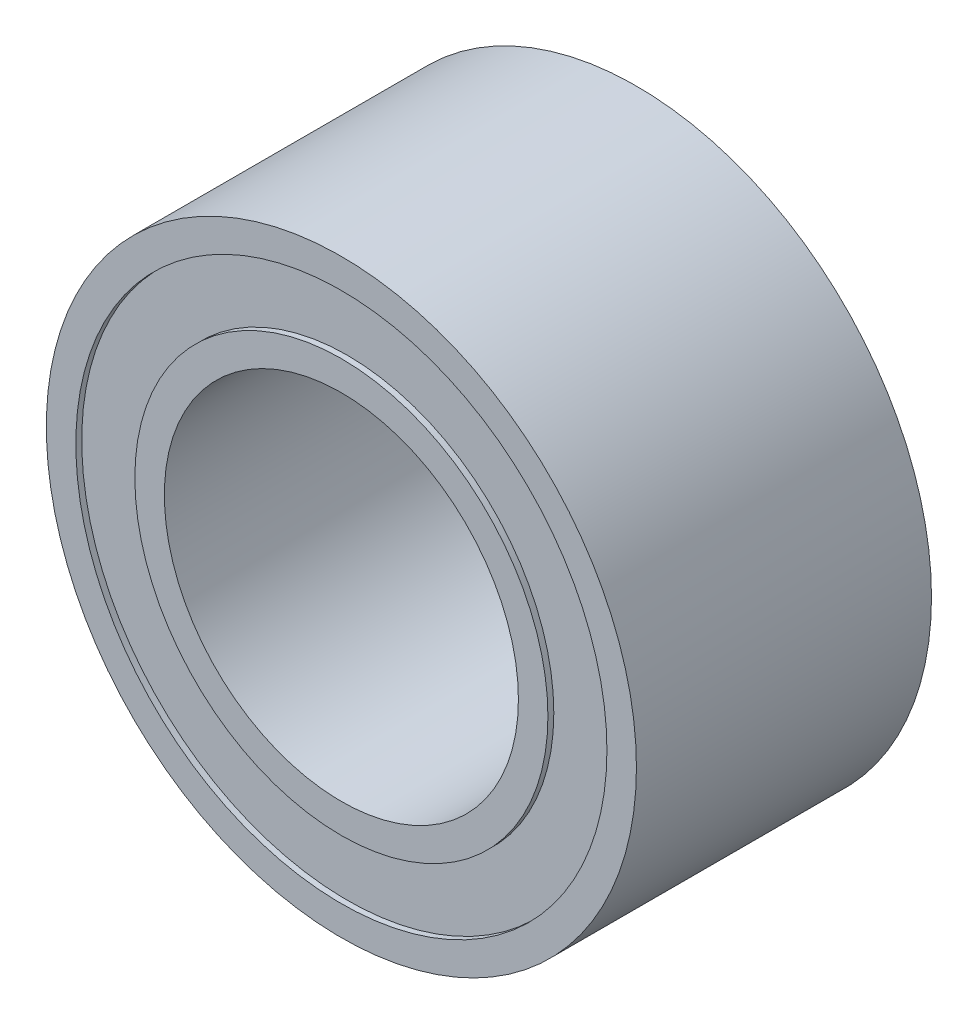
ISO-10303-21;
HEADER;
FILE_DESCRIPTION(('STEP AP214'),'2;1');
FILE_NAME('part.step','',(''),(''),'','','');
FILE_SCHEMA(('AUTOMOTIVE_DESIGN { 1 0 10303 214 1 1 1 1 }'));
ENDSEC;
DATA;
#1=APPLICATION_CONTEXT('core data for automotive mechanical design processes');
#2=APPLICATION_PROTOCOL_DEFINITION('international standard','automotive_design',2000,#1);
#3=PRODUCT_CONTEXT('',#1,'mechanical');
#4=PRODUCT('Part','Part','',(#3));
#5=PRODUCT_RELATED_PRODUCT_CATEGORY('part','',(#4));
#6=PRODUCT_DEFINITION_FORMATION('','',#4);
#7=PRODUCT_DEFINITION_CONTEXT('part definition',#1,'design');
#8=PRODUCT_DEFINITION('design','',#6,#7);
#9=PRODUCT_DEFINITION_SHAPE('','',#8);
#10=(LENGTH_UNIT() NAMED_UNIT(*) SI_UNIT(.MILLI.,.METRE.));
#11=(NAMED_UNIT(*) PLANE_ANGLE_UNIT() SI_UNIT($,.RADIAN.));
#12=(NAMED_UNIT(*) SI_UNIT($,.STERADIAN.) SOLID_ANGLE_UNIT());
#13=UNCERTAINTY_MEASURE_WITH_UNIT(LENGTH_MEASURE(1.E-05),#10,'distance_accuracy_value','');
#14=(GEOMETRIC_REPRESENTATION_CONTEXT(3) GLOBAL_UNCERTAINTY_ASSIGNED_CONTEXT((#13)) GLOBAL_UNIT_ASSIGNED_CONTEXT((#10,
#11,#12)) REPRESENTATION_CONTEXT('',''));
#15=CARTESIAN_POINT('',(0.,0.,0.));
#16=DIRECTION('',(0.,0.,1.));
#17=DIRECTION('',(1.,0.,0.));
#18=AXIS2_PLACEMENT_3D('',#15,#16,#17);
#19=CARTESIAN_POINT('',(0.,0.,0.));
#20=DIRECTION('',(0.,0.,1.));
#21=DIRECTION('',(1.,0.,0.));
#22=AXIS2_PLACEMENT_3D('',#19,#20,#21);
#23=PLANE('',#22);
#24=CARTESIAN_POINT('',(0.,0.,0.));
#25=DIRECTION('',(0.,0.,1.));
#26=DIRECTION('',(1.,0.,0.));
#27=AXIS2_PLACEMENT_3D('',#24,#25,#26);
#28=CIRCLE('',#27,7.62);
#29=CARTESIAN_POINT('',(7.62,0.,0.));
#30=VERTEX_POINT('',#29);
#31=EDGE_CURVE('E46',#30,#30,#28,.T.);
#32=ORIENTED_EDGE('',*,*,#31,.T.);
#33=EDGE_LOOP('',(#32));
#34=FACE_BOUND('',#33,.T.);
#35=CARTESIAN_POINT('',(0.,0.,0.));
#36=DIRECTION('',(0.,0.,1.));
#37=DIRECTION('',(1.,0.,0.));
#38=AXIS2_PLACEMENT_3D('',#35,#36,#37);
#39=CIRCLE('',#38,8.89);
#40=CARTESIAN_POINT('',(8.89,0.,0.));
#41=VERTEX_POINT('',#40);
#42=EDGE_CURVE('E68',#41,#41,#39,.T.);
#43=ORIENTED_EDGE('',*,*,#42,.F.);
#44=EDGE_LOOP('',(#43));
#45=FACE_BOUND('',#44,.T.);
#46=ADVANCED_FACE('F33',(#34,#45),#23,.F.);
#47=CARTESIAN_POINT('',(0.,0.,12.7));
#48=DIRECTION('',(0.,0.,1.));
#49=DIRECTION('',(1.,0.,0.));
#50=AXIS2_PLACEMENT_3D('',#47,#48,#49);
#51=PLANE('',#50);
#52=CARTESIAN_POINT('',(0.,0.,12.7));
#53=DIRECTION('',(0.,0.,1.));
#54=DIRECTION('',(1.,0.,0.));
#55=AXIS2_PLACEMENT_3D('',#52,#53,#54);
#56=CIRCLE('',#55,7.62);
#57=CARTESIAN_POINT('',(7.62,0.,12.7));
#58=VERTEX_POINT('',#57);
#59=EDGE_CURVE('E44',#58,#58,#56,.T.);
#60=ORIENTED_EDGE('',*,*,#59,.F.);
#61=EDGE_LOOP('',(#60));
#62=FACE_BOUND('',#61,.T.);
#63=CARTESIAN_POINT('',(0.,0.,12.7));
#64=DIRECTION('',(0.,0.,1.));
#65=DIRECTION('',(1.,0.,0.));
#66=AXIS2_PLACEMENT_3D('',#63,#64,#65);
#67=CIRCLE('',#66,8.89);
#68=CARTESIAN_POINT('',(8.89,0.,12.7));
#69=VERTEX_POINT('',#68);
#70=EDGE_CURVE('E56',#69,#69,#67,.T.);
#71=ORIENTED_EDGE('',*,*,#70,.T.);
#72=EDGE_LOOP('',(#71));
#73=FACE_BOUND('',#72,.T.);
#74=ADVANCED_FACE('F88',(#62,#73),#51,.T.);
#75=CARTESIAN_POINT('',(0.,0.,12.7));
#76=DIRECTION('',(0.,0.,1.));
#77=DIRECTION('',(1.,0.,0.));
#78=AXIS2_PLACEMENT_3D('',#75,#76,#77);
#79=CIRCLE('',#78,11.43);
#80=CARTESIAN_POINT('',(11.43,0.,12.7));
#81=VERTEX_POINT('',#80);
#82=EDGE_CURVE('E52',#81,#81,#79,.T.);
#83=ORIENTED_EDGE('',*,*,#82,.F.);
#84=EDGE_LOOP('',(#83));
#85=FACE_BOUND('',#84,.T.);
#86=CARTESIAN_POINT('',(0.,0.,12.7));
#87=DIRECTION('',(0.,0.,1.));
#88=DIRECTION('',(1.,0.,0.));
#89=AXIS2_PLACEMENT_3D('',#86,#87,#88);
#90=CIRCLE('',#89,12.7);
#91=CARTESIAN_POINT('',(12.7,0.,12.7));
#92=VERTEX_POINT('',#91);
#93=EDGE_CURVE('E10',#92,#92,#90,.T.);
#94=ORIENTED_EDGE('',*,*,#93,.T.);
#95=EDGE_LOOP('',(#94));
#96=FACE_BOUND('',#95,.T.);
#97=ADVANCED_FACE('F94',(#85,#96),#51,.T.);
#98=CARTESIAN_POINT('',(0.,0.,0.));
#99=DIRECTION('',(0.,0.,1.));
#100=DIRECTION('',(1.,0.,0.));
#101=AXIS2_PLACEMENT_3D('',#98,#99,#100);
#102=CIRCLE('',#101,11.43);
#103=CARTESIAN_POINT('',(11.43,0.,0.));
#104=VERTEX_POINT('',#103);
#105=EDGE_CURVE('E64',#104,#104,#102,.T.);
#106=ORIENTED_EDGE('',*,*,#105,.T.);
#107=EDGE_LOOP('',(#106));
#108=FACE_BOUND('',#107,.T.);
#109=CARTESIAN_POINT('',(0.,0.,0.));
#110=DIRECTION('',(0.,0.,1.));
#111=DIRECTION('',(1.,0.,0.));
#112=AXIS2_PLACEMENT_3D('',#109,#110,#111);
#113=CIRCLE('',#112,12.7);
#114=CARTESIAN_POINT('',(12.7,0.,0.));
#115=VERTEX_POINT('',#114);
#116=EDGE_CURVE('E37',#115,#115,#113,.T.);
#117=ORIENTED_EDGE('',*,*,#116,.F.);
#118=EDGE_LOOP('',(#117));
#119=FACE_BOUND('',#118,.T.);
#120=ADVANCED_FACE('F90',(#108,#119),#23,.F.);
#121=CARTESIAN_POINT('',(0.,0.,12.7));
#122=DIRECTION('',(0.,0.,-1.));
#123=DIRECTION('',(-1.,0.,0.));
#124=AXIS2_PLACEMENT_3D('',#121,#122,#123);
#125=CYLINDRICAL_SURFACE('',#124,12.7);
#126=ORIENTED_EDGE('',*,*,#93,.F.);
#127=EDGE_LOOP('',(#126));
#128=FACE_BOUND('',#127,.T.);
#129=ORIENTED_EDGE('',*,*,#116,.T.);
#130=EDGE_LOOP('',(#129));
#131=FACE_BOUND('',#130,.T.);
#132=ADVANCED_FACE('F35',(#128,#131),#125,.T.);
#133=CARTESIAN_POINT('',(0.,0.,12.7));
#134=DIRECTION('',(0.,0.,-1.));
#135=DIRECTION('',(-1.,0.,0.));
#136=AXIS2_PLACEMENT_3D('',#133,#134,#135);
#137=CYLINDRICAL_SURFACE('',#136,7.62);
#138=ORIENTED_EDGE('',*,*,#59,.T.);
#139=EDGE_LOOP('',(#138));
#140=FACE_BOUND('',#139,.T.);
#141=ORIENTED_EDGE('',*,*,#31,.F.);
#142=EDGE_LOOP('',(#141));
#143=FACE_BOUND('',#142,.T.);
#144=ADVANCED_FACE('F103',(#140,#143),#137,.F.);
#145=CARTESIAN_POINT('',(0.,0.,12.446));
#146=DIRECTION('',(0.,0.,1.));
#147=DIRECTION('',(1.,0.,0.));
#148=AXIS2_PLACEMENT_3D('',#145,#146,#147);
#149=CYLINDRICAL_SURFACE('',#148,8.89);
#150=CARTESIAN_POINT('',(0.,0.,12.446));
#151=DIRECTION('',(0.,0.,1.));
#152=DIRECTION('',(1.,0.,0.));
#153=AXIS2_PLACEMENT_3D('',#150,#151,#152);
#154=CIRCLE('',#153,8.89);
#155=CARTESIAN_POINT('',(8.89,0.,12.446));
#156=VERTEX_POINT('',#155);
#157=EDGE_CURVE('E55',#156,#156,#154,.T.);
#158=ORIENTED_EDGE('',*,*,#157,.T.);
#159=EDGE_LOOP('',(#158));
#160=FACE_BOUND('',#159,.T.);
#161=ORIENTED_EDGE('',*,*,#70,.F.);
#162=EDGE_LOOP('',(#161));
#163=FACE_BOUND('',#162,.T.);
#164=ADVANCED_FACE('F125',(#160,#163),#149,.T.);
#165=CARTESIAN_POINT('',(0.,0.,12.446));
#166=DIRECTION('',(0.,0.,1.));
#167=DIRECTION('',(1.,0.,0.));
#168=AXIS2_PLACEMENT_3D('',#165,#166,#167);
#169=CYLINDRICAL_SURFACE('',#168,11.43);
#170=CARTESIAN_POINT('',(0.,0.,12.446));
#171=DIRECTION('',(0.,0.,1.));
#172=DIRECTION('',(1.,0.,0.));
#173=AXIS2_PLACEMENT_3D('',#170,#171,#172);
#174=CIRCLE('',#173,11.43);
#175=CARTESIAN_POINT('',(11.43,0.,12.446));
#176=VERTEX_POINT('',#175);
#177=EDGE_CURVE('E49',#176,#176,#174,.T.);
#178=ORIENTED_EDGE('',*,*,#177,.F.);
#179=EDGE_LOOP('',(#178));
#180=FACE_BOUND('',#179,.T.);
#181=ORIENTED_EDGE('',*,*,#82,.T.);
#182=EDGE_LOOP('',(#181));
#183=FACE_BOUND('',#182,.T.);
#184=ADVANCED_FACE('F121',(#180,#183),#169,.F.);
#185=CARTESIAN_POINT('',(0.,0.,12.446));
#186=DIRECTION('',(0.,0.,1.));
#187=DIRECTION('',(1.,0.,0.));
#188=AXIS2_PLACEMENT_3D('',#185,#186,#187);
#189=PLANE('',#188);
#190=ORIENTED_EDGE('',*,*,#157,.F.);
#191=EDGE_LOOP('',(#190));
#192=FACE_BOUND('',#191,.T.);
#193=ORIENTED_EDGE('',*,*,#177,.T.);
#194=EDGE_LOOP('',(#193));
#195=FACE_BOUND('',#194,.T.);
#196=ADVANCED_FACE('F83',(#192,#195),#189,.T.);
#197=CARTESIAN_POINT('',(0.,0.,0.254));
#198=DIRECTION('',(0.,0.,-1.));
#199=DIRECTION('',(-1.,0.,0.));
#200=AXIS2_PLACEMENT_3D('',#197,#198,#199);
#201=CYLINDRICAL_SURFACE('',#200,8.89);
#202=CARTESIAN_POINT('',(0.,0.,0.254));
#203=DIRECTION('',(0.,0.,1.));
#204=DIRECTION('',(1.,0.,0.));
#205=AXIS2_PLACEMENT_3D('',#202,#203,#204);
#206=CIRCLE('',#205,8.89);
#207=CARTESIAN_POINT('',(8.89,0.,0.254));
#208=VERTEX_POINT('',#207);
#209=EDGE_CURVE('E67',#208,#208,#206,.T.);
#210=ORIENTED_EDGE('',*,*,#209,.F.);
#211=EDGE_LOOP('',(#210));
#212=FACE_BOUND('',#211,.T.);
#213=ORIENTED_EDGE('',*,*,#42,.T.);
#214=EDGE_LOOP('',(#213));
#215=FACE_BOUND('',#214,.T.);
#216=ADVANCED_FACE('F79',(#212,#215),#201,.T.);
#217=CARTESIAN_POINT('',(0.,0.,0.254));
#218=DIRECTION('',(0.,0.,-1.));
#219=DIRECTION('',(-1.,0.,0.));
#220=AXIS2_PLACEMENT_3D('',#217,#218,#219);
#221=CYLINDRICAL_SURFACE('',#220,11.43);
#222=CARTESIAN_POINT('',(0.,0.,0.254));
#223=DIRECTION('',(0.,0.,1.));
#224=DIRECTION('',(1.,0.,0.));
#225=AXIS2_PLACEMENT_3D('',#222,#223,#224);
#226=CIRCLE('',#225,11.43);
#227=CARTESIAN_POINT('',(11.43,0.,0.254));
#228=VERTEX_POINT('',#227);
#229=EDGE_CURVE('E59',#228,#228,#226,.T.);
#230=ORIENTED_EDGE('',*,*,#229,.T.);
#231=EDGE_LOOP('',(#230));
#232=FACE_BOUND('',#231,.T.);
#233=ORIENTED_EDGE('',*,*,#105,.F.);
#234=EDGE_LOOP('',(#233));
#235=FACE_BOUND('',#234,.T.);
#236=ADVANCED_FACE('F82',(#232,#235),#221,.F.);
#237=CARTESIAN_POINT('',(0.,0.,0.254));
#238=DIRECTION('',(0.,0.,-1.));
#239=DIRECTION('',(1.,0.,0.));
#240=AXIS2_PLACEMENT_3D('',#237,#238,#239);
#241=PLANE('',#240);
#242=ORIENTED_EDGE('',*,*,#209,.T.);
#243=EDGE_LOOP('',(#242));
#244=FACE_BOUND('',#243,.T.);
#245=ORIENTED_EDGE('',*,*,#229,.F.);
#246=EDGE_LOOP('',(#245));
#247=FACE_BOUND('',#246,.T.);
#248=ADVANCED_FACE('F76',(#244,#247),#241,.T.);
#249=CLOSED_SHELL('',(#46,#74,#97,#120,#132,#144,#164,#184,#196,#216,#236,#248));
#250=MANIFOLD_SOLID_BREP('B2',#249);
#251=ADVANCED_BREP_SHAPE_REPRESENTATION('',(#18,#250),#14);
#252=SHAPE_DEFINITION_REPRESENTATION(#9,#251);
ENDSEC;
END-ISO-10303-21;
